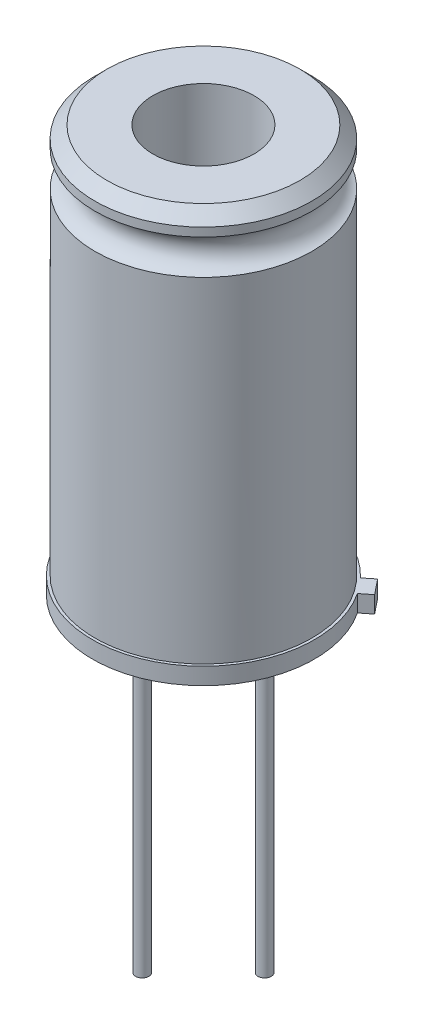
ISO-10303-21;
HEADER;
FILE_DESCRIPTION(('STEP AP214'),'2;1');
FILE_NAME('part.step','',(''),(''),'','','');
FILE_SCHEMA(('AUTOMOTIVE_DESIGN { 1 0 10303 214 1 1 1 1 }'));
ENDSEC;
DATA;
#1=APPLICATION_CONTEXT('core data for automotive mechanical design processes');
#2=APPLICATION_PROTOCOL_DEFINITION('international standard','automotive_design',2000,#1);
#3=PRODUCT_CONTEXT('',#1,'mechanical');
#4=PRODUCT('Part','Part','',(#3));
#5=PRODUCT_RELATED_PRODUCT_CATEGORY('part','',(#4));
#6=PRODUCT_DEFINITION_FORMATION('','',#4);
#7=PRODUCT_DEFINITION_CONTEXT('part definition',#1,'design');
#8=PRODUCT_DEFINITION('design','',#6,#7);
#9=PRODUCT_DEFINITION_SHAPE('','',#8);
#10=(LENGTH_UNIT() NAMED_UNIT(*) SI_UNIT(.MILLI.,.METRE.));
#11=(NAMED_UNIT(*) PLANE_ANGLE_UNIT() SI_UNIT($,.RADIAN.));
#12=(NAMED_UNIT(*) SI_UNIT($,.STERADIAN.) SOLID_ANGLE_UNIT());
#13=UNCERTAINTY_MEASURE_WITH_UNIT(LENGTH_MEASURE(1.E-05),#10,'distance_accuracy_value','');
#14=(GEOMETRIC_REPRESENTATION_CONTEXT(3) GLOBAL_UNCERTAINTY_ASSIGNED_CONTEXT((#13)) GLOBAL_UNIT_ASSIGNED_CONTEXT((#10,
#11,#12)) REPRESENTATION_CONTEXT('',''));
#15=CARTESIAN_POINT('',(0.,0.,0.));
#16=DIRECTION('',(0.,0.,1.));
#17=DIRECTION('',(1.,0.,0.));
#18=AXIS2_PLACEMENT_3D('',#15,#16,#17);
#19=CARTESIAN_POINT('',(0.,16.2,0.));
#20=DIRECTION('',(0.,-1.,0.));
#21=DIRECTION('',(0.,0.,-1.));
#22=AXIS2_PLACEMENT_3D('',#19,#20,#21);
#23=CYLINDRICAL_SURFACE('',#22,4.5);
#24=CARTESIAN_POINT('',(0.,15.7037584695949,0.));
#25=DIRECTION('',(0.,-1.,0.));
#26=DIRECTION('',(0.,0.,-1.));
#27=AXIS2_PLACEMENT_3D('',#24,#25,#26);
#28=CIRCLE('',#27,4.5);
#29=CARTESIAN_POINT('',(0.,15.7037584695949,-4.5));
#30=VERTEX_POINT('',#29);
#31=EDGE_CURVE('E252',#30,#30,#28,.T.);
#32=ORIENTED_EDGE('',*,*,#31,.T.);
#33=EDGE_LOOP('',(#32));
#34=FACE_BOUND('',#33,.T.);
#35=CARTESIAN_POINT('',(0.,15.34284161474,0.));
#36=DIRECTION('',(0.,-1.,0.));
#37=DIRECTION('',(0.,0.,-1.));
#38=AXIS2_PLACEMENT_3D('',#35,#36,#37);
#39=CIRCLE('',#38,4.5);
#40=CARTESIAN_POINT('',(0.,15.34284161474,-4.5));
#41=VERTEX_POINT('',#40);
#42=EDGE_CURVE('E125',#41,#41,#39,.T.);
#43=ORIENTED_EDGE('',*,*,#42,.F.);
#44=EDGE_LOOP('',(#43));
#45=FACE_BOUND('',#44,.T.);
#46=ADVANCED_FACE('F36',(#34,#45),#23,.T.);
#47=CARTESIAN_POINT('',(0.,14.62,0.));
#48=DIRECTION('',(0.,1.,0.));
#49=DIRECTION('',(0.,0.,1.));
#50=AXIS2_PLACEMENT_3D('',#47,#48,#49);
#51=TOROIDAL_SURFACE('',#50,4.7,0.749999999999999);
#52=CARTESIAN_POINT('',(0.,13.89715838526,0.));
#53=DIRECTION('',(0.,1.,0.));
#54=DIRECTION('',(0.,0.,1.));
#55=AXIS2_PLACEMENT_3D('',#52,#53,#54);
#56=CIRCLE('',#55,4.5);
#57=CARTESIAN_POINT('',(0.,13.89715838526,4.5));
#58=VERTEX_POINT('',#57);
#59=EDGE_CURVE('E117',#58,#58,#56,.T.);
#60=ORIENTED_EDGE('',*,*,#59,.T.);
#61=EDGE_LOOP('',(#60));
#62=FACE_BOUND('',#61,.T.);
#63=ORIENTED_EDGE('',*,*,#42,.T.);
#64=EDGE_LOOP('',(#63));
#65=FACE_BOUND('',#64,.T.);
#66=ADVANCED_FACE('F191',(#62,#65),#51,.F.);
#67=CARTESIAN_POINT('',(0.,0.,0.));
#68=DIRECTION('',(0.,-1.,0.));
#69=DIRECTION('',(0.,0.,-1.));
#70=AXIS2_PLACEMENT_3D('',#67,#68,#69);
#71=CIRCLE('',#70,4.5);
#72=CARTESIAN_POINT('',(0.,0.,-4.5));
#73=VERTEX_POINT('',#72);
#74=EDGE_CURVE('E114',#73,#73,#71,.T.);
#75=ORIENTED_EDGE('',*,*,#74,.F.);
#76=EDGE_LOOP('',(#75));
#77=FACE_BOUND('',#76,.T.);
#78=ORIENTED_EDGE('',*,*,#59,.F.);
#79=EDGE_LOOP('',(#78));
#80=FACE_BOUND('',#79,.T.);
#81=ADVANCED_FACE('F193',(#77,#80),#23,.T.);
#82=CARTESIAN_POINT('',(0.,-0.7,0.));
#83=DIRECTION('',(0.,1.,0.));
#84=DIRECTION('',(0.,0.,1.));
#85=AXIS2_PLACEMENT_3D('',#82,#83,#84);
#86=CYLINDRICAL_SURFACE('',#85,4.60963100218197);
#87=CARTESIAN_POINT('',(0.,0.,0.));
#88=DIRECTION('',(0.,-1.,0.));
#89=DIRECTION('',(0.,0.,-1.));
#90=AXIS2_PLACEMENT_3D('',#87,#88,#89);
#91=CIRCLE('',#90,4.60963100218197);
#92=CARTESIAN_POINT('',(3.8406891704971,0.,-2.54907918117571));
#93=VERTEX_POINT('',#92);
#94=CARTESIAN_POINT('',(3.34212620645192,0.,-3.17472682233045));
#95=VERTEX_POINT('',#94);
#96=EDGE_CURVE('E104',#93,#95,#91,.T.);
#97=ORIENTED_EDGE('',*,*,#96,.T.);
#98=DIRECTION('',(0.,1.,0.));
#99=VECTOR('',#98,1.);
#100=CARTESIAN_POINT('',(3.34212620645192,-0.7,-3.17472682233045));
#101=LINE('',#100,#99);
#102=CARTESIAN_POINT('',(3.34212620645192,-0.7,-3.17472682233045));
#103=VERTEX_POINT('',#102);
#104=EDGE_CURVE('E95',#103,#95,#101,.T.);
#105=ORIENTED_EDGE('',*,*,#104,.F.);
#106=CARTESIAN_POINT('',(0.,-0.7,0.));
#107=DIRECTION('',(0.,-1.,0.));
#108=DIRECTION('',(0.,0.,-1.));
#109=AXIS2_PLACEMENT_3D('',#106,#107,#108);
#110=CIRCLE('',#109,4.60963100218197);
#111=CARTESIAN_POINT('',(3.8406891704971,-0.7,-2.54907918117571));
#112=VERTEX_POINT('',#111);
#113=EDGE_CURVE('E89',#112,#103,#110,.T.);
#114=ORIENTED_EDGE('',*,*,#113,.F.);
#115=DIRECTION('',(0.,1.,0.));
#116=VECTOR('',#115,1.);
#117=CARTESIAN_POINT('',(3.8406891704971,-0.7,-2.54907918117571));
#118=LINE('',#117,#116);
#119=EDGE_CURVE('E100',#112,#93,#118,.T.);
#120=ORIENTED_EDGE('',*,*,#119,.T.);
#121=EDGE_LOOP('',(#97,#105,#114,#120));
#122=FACE_BOUND('',#121,.T.);
#123=ADVANCED_FACE('F202',(#122),#86,.T.);
#124=CARTESIAN_POINT('',(3.34212620645192,-0.7,-3.17472682233045));
#125=DIRECTION('',(0.623203705056468,0.,0.782059551443425));
#126=DIRECTION('',(0.782059551443425,0.,-0.623203705056468));
#127=AXIS2_PLACEMENT_3D('',#124,#125,#126);
#128=PLANE('',#127);
#129=DIRECTION('',(0.782059551443425,0.,-0.623203705056468));
#130=VECTOR('',#129,1.);
#131=CARTESIAN_POINT('',(3.34212620645192,0.,-3.17472682233045));
#132=LINE('',#131,#130);
#133=CARTESIAN_POINT('',(3.73922223033888,0.,-3.49116271636536));
#134=VERTEX_POINT('',#133);
#135=EDGE_CURVE('E94',#95,#134,#132,.T.);
#136=ORIENTED_EDGE('',*,*,#135,.T.);
#137=DIRECTION('',(0.,1.,0.));
#138=VECTOR('',#137,1.);
#139=CARTESIAN_POINT('',(3.73922223033888,-0.7,-3.49116271636536));
#140=LINE('',#139,#138);
#141=CARTESIAN_POINT('',(3.73922223033888,-0.7,-3.49116271636536));
#142=VERTEX_POINT('',#141);
#143=EDGE_CURVE('E92',#142,#134,#140,.T.);
#144=ORIENTED_EDGE('',*,*,#143,.F.);
#145=DIRECTION('',(0.782059551443425,0.,-0.623203705056468));
#146=VECTOR('',#145,1.);
#147=CARTESIAN_POINT('',(3.34212620645192,-0.7,-3.17472682233045));
#148=LINE('',#147,#146);
#149=EDGE_CURVE('E84',#103,#142,#148,.T.);
#150=ORIENTED_EDGE('',*,*,#149,.F.);
#151=ORIENTED_EDGE('',*,*,#104,.T.);
#152=EDGE_LOOP('',(#136,#144,#150,#151));
#153=FACE_BOUND('',#152,.T.);
#154=ADVANCED_FACE('F93',(#153),#128,.F.);
#155=CARTESIAN_POINT('',(3.73922223033888,-0.7,-3.49116271636536));
#156=DIRECTION('',(-0.782059551443424,0.,0.623203705056469));
#157=DIRECTION('',(0.623203705056469,0.,0.782059551443424));
#158=AXIS2_PLACEMENT_3D('',#155,#156,#157);
#159=PLANE('',#158);
#160=DIRECTION('',(0.623203705056468,0.,0.782059551443424));
#161=VECTOR('',#160,1.);
#162=CARTESIAN_POINT('',(3.73922223033888,0.,-3.49116271636536));
#163=LINE('',#162,#161);
#164=CARTESIAN_POINT('',(4.23778519438405,0.,-2.86551507521062));
#165=VERTEX_POINT('',#164);
#166=EDGE_CURVE('E70',#134,#165,#163,.T.);
#167=ORIENTED_EDGE('',*,*,#166,.T.);
#168=DIRECTION('',(0.,1.,0.));
#169=VECTOR('',#168,1.);
#170=CARTESIAN_POINT('',(4.23778519438405,-0.7,-2.86551507521062));
#171=LINE('',#170,#169);
#172=CARTESIAN_POINT('',(4.23778519438405,-0.7,-2.86551507521062));
#173=VERTEX_POINT('',#172);
#174=EDGE_CURVE('E96',#173,#165,#171,.T.);
#175=ORIENTED_EDGE('',*,*,#174,.F.);
#176=DIRECTION('',(0.623203705056468,0.,0.782059551443424));
#177=VECTOR('',#176,1.);
#178=CARTESIAN_POINT('',(3.73922223033888,-0.7,-3.49116271636536));
#179=LINE('',#178,#177);
#180=EDGE_CURVE('E87',#142,#173,#179,.T.);
#181=ORIENTED_EDGE('',*,*,#180,.F.);
#182=ORIENTED_EDGE('',*,*,#143,.T.);
#183=EDGE_LOOP('',(#167,#175,#181,#182));
#184=FACE_BOUND('',#183,.T.);
#185=ADVANCED_FACE('F98',(#184),#159,.F.);
#186=CARTESIAN_POINT('',(3.8406891704971,-0.7,-2.54907918117571));
#187=DIRECTION('',(-0.62320370505647,0.,-0.782059551443423));
#188=DIRECTION('',(-0.782059551443423,0.,0.62320370505647));
#189=AXIS2_PLACEMENT_3D('',#186,#187,#188);
#190=PLANE('',#189);
#191=DIRECTION('',(-0.782059551443423,0.,0.62320370505647));
#192=VECTOR('',#191,1.);
#193=CARTESIAN_POINT('',(3.8406891704971,0.,-2.54907918117571));
#194=LINE('',#193,#192);
#195=EDGE_CURVE('E76',#165,#93,#194,.T.);
#196=ORIENTED_EDGE('',*,*,#195,.T.);
#197=ORIENTED_EDGE('',*,*,#119,.F.);
#198=DIRECTION('',(-0.782059551443423,0.,0.62320370505647));
#199=VECTOR('',#198,1.);
#200=CARTESIAN_POINT('',(3.8406891704971,-0.7,-2.54907918117571));
#201=LINE('',#200,#199);
#202=EDGE_CURVE('E53',#173,#112,#201,.T.);
#203=ORIENTED_EDGE('',*,*,#202,.F.);
#204=ORIENTED_EDGE('',*,*,#174,.T.);
#205=EDGE_LOOP('',(#196,#197,#203,#204));
#206=FACE_BOUND('',#205,.T.);
#207=ADVANCED_FACE('F219',(#206),#190,.F.);
#208=CARTESIAN_POINT('',(0.,-0.7,0.));
#209=DIRECTION('',(0.,-1.,0.));
#210=DIRECTION('',(0.,0.,-1.));
#211=AXIS2_PLACEMENT_3D('',#208,#209,#210);
#212=PLANE('',#211);
#213=CARTESIAN_POINT('',(0.,-0.7,-2.54));
#214=DIRECTION('',(0.,1.,0.));
#215=DIRECTION('',(0.,0.,1.));
#216=AXIS2_PLACEMENT_3D('',#213,#214,#215);
#217=CIRCLE('',#216,0.8);
#218=CARTESIAN_POINT('',(0.,-0.7,-1.74));
#219=VERTEX_POINT('',#218);
#220=EDGE_CURVE('E151',#219,#219,#217,.T.);
#221=ORIENTED_EDGE('',*,*,#220,.T.);
#222=EDGE_LOOP('',(#221));
#223=FACE_BOUND('',#222,.T.);
#224=CARTESIAN_POINT('',(-2.54,-0.7,0.));
#225=DIRECTION('',(0.,1.,0.));
#226=DIRECTION('',(0.,0.,1.));
#227=AXIS2_PLACEMENT_3D('',#224,#225,#226);
#228=CIRCLE('',#227,0.8);
#229=CARTESIAN_POINT('',(-2.54,-0.7,0.799999999999982));
#230=VERTEX_POINT('',#229);
#231=EDGE_CURVE('E150',#230,#230,#228,.T.);
#232=ORIENTED_EDGE('',*,*,#231,.T.);
#233=EDGE_LOOP('',(#232));
#234=FACE_BOUND('',#233,.T.);
#235=CARTESIAN_POINT('',(0.,-0.7,2.54));
#236=DIRECTION('',(0.,1.,0.));
#237=DIRECTION('',(0.,0.,1.));
#238=AXIS2_PLACEMENT_3D('',#235,#236,#237);
#239=CIRCLE('',#238,0.8);
#240=CARTESIAN_POINT('',(0.,-0.7,3.34));
#241=VERTEX_POINT('',#240);
#242=EDGE_CURVE('E161',#241,#241,#239,.T.);
#243=ORIENTED_EDGE('',*,*,#242,.T.);
#244=EDGE_LOOP('',(#243));
#245=FACE_BOUND('',#244,.T.);
#246=CARTESIAN_POINT('',(2.54,-0.7,0.));
#247=DIRECTION('',(0.,1.,0.));
#248=DIRECTION('',(0.,0.,1.));
#249=AXIS2_PLACEMENT_3D('',#246,#247,#248);
#250=CIRCLE('',#249,0.8);
#251=CARTESIAN_POINT('',(2.54,-0.7,0.8));
#252=VERTEX_POINT('',#251);
#253=EDGE_CURVE('E107',#252,#252,#250,.T.);
#254=ORIENTED_EDGE('',*,*,#253,.T.);
#255=EDGE_LOOP('',(#254));
#256=FACE_BOUND('',#255,.T.);
#257=ORIENTED_EDGE('',*,*,#113,.T.);
#258=ORIENTED_EDGE('',*,*,#149,.T.);
#259=ORIENTED_EDGE('',*,*,#180,.T.);
#260=ORIENTED_EDGE('',*,*,#202,.T.);
#261=EDGE_LOOP('',(#257,#258,#259,#260));
#262=FACE_BOUND('',#261,.T.);
#263=ADVANCED_FACE('F85',(#223,#234,#245,#256,#262),#212,.T.);
#264=CARTESIAN_POINT('',(0.,0.,0.));
#265=DIRECTION('',(0.,-1.,0.));
#266=DIRECTION('',(0.,0.,-1.));
#267=AXIS2_PLACEMENT_3D('',#264,#265,#266);
#268=PLANE('',#267);
#269=ORIENTED_EDGE('',*,*,#74,.T.);
#270=EDGE_LOOP('',(#269));
#271=FACE_BOUND('',#270,.T.);
#272=ORIENTED_EDGE('',*,*,#96,.F.);
#273=ORIENTED_EDGE('',*,*,#195,.F.);
#274=ORIENTED_EDGE('',*,*,#166,.F.);
#275=ORIENTED_EDGE('',*,*,#135,.F.);
#276=EDGE_LOOP('',(#272,#273,#274,#275));
#277=FACE_BOUND('',#276,.T.);
#278=ADVANCED_FACE('F186',(#271,#277),#268,.F.);
#279=CARTESIAN_POINT('',(2.54,-0.7,0.));
#280=DIRECTION('',(0.,1.,0.));
#281=DIRECTION('',(0.,0.,1.));
#282=AXIS2_PLACEMENT_3D('',#279,#280,#281);
#283=CYLINDRICAL_SURFACE('',#282,0.8);
#284=ORIENTED_EDGE('',*,*,#253,.F.);
#285=EDGE_LOOP('',(#284));
#286=FACE_BOUND('',#285,.T.);
#287=CARTESIAN_POINT('',(2.54,0.,0.));
#288=DIRECTION('',(0.,1.,0.));
#289=DIRECTION('',(0.,0.,1.));
#290=AXIS2_PLACEMENT_3D('',#287,#288,#289);
#291=CIRCLE('',#290,0.8);
#292=CARTESIAN_POINT('',(2.54,0.,0.8));
#293=VERTEX_POINT('',#292);
#294=EDGE_CURVE('E164',#293,#293,#291,.T.);
#295=ORIENTED_EDGE('',*,*,#294,.T.);
#296=EDGE_LOOP('',(#295));
#297=FACE_BOUND('',#296,.T.);
#298=ADVANCED_FACE('F172',(#286,#297),#283,.F.);
#299=CARTESIAN_POINT('',(2.54,0.,0.));
#300=DIRECTION('',(0.,1.,0.));
#301=DIRECTION('',(0.,0.,1.));
#302=AXIS2_PLACEMENT_3D('',#299,#300,#301);
#303=PLANE('',#302);
#304=CARTESIAN_POINT('',(2.54,0.,0.));
#305=DIRECTION('',(0.,1.,0.));
#306=DIRECTION('',(0.,0.,1.));
#307=AXIS2_PLACEMENT_3D('',#304,#305,#306);
#308=CIRCLE('',#307,0.275);
#309=CARTESIAN_POINT('',(2.54,0.,0.275));
#310=VERTEX_POINT('',#309);
#311=EDGE_CURVE('E121',#310,#310,#308,.F.);
#312=ORIENTED_EDGE('',*,*,#311,.F.);
#313=EDGE_LOOP('',(#312));
#314=FACE_BOUND('',#313,.T.);
#315=ORIENTED_EDGE('',*,*,#294,.F.);
#316=EDGE_LOOP('',(#315));
#317=FACE_BOUND('',#316,.T.);
#318=ADVANCED_FACE('F174',(#314,#317),#303,.F.);
#319=CARTESIAN_POINT('',(0.,-0.7,2.54));
#320=DIRECTION('',(0.,1.,0.));
#321=DIRECTION('',(0.,0.,1.));
#322=AXIS2_PLACEMENT_3D('',#319,#320,#321);
#323=CYLINDRICAL_SURFACE('',#322,0.8);
#324=ORIENTED_EDGE('',*,*,#242,.F.);
#325=EDGE_LOOP('',(#324));
#326=FACE_BOUND('',#325,.T.);
#327=CARTESIAN_POINT('',(0.,0.,2.54));
#328=DIRECTION('',(0.,1.,0.));
#329=DIRECTION('',(0.,0.,1.));
#330=AXIS2_PLACEMENT_3D('',#327,#328,#329);
#331=CIRCLE('',#330,0.8);
#332=CARTESIAN_POINT('',(0.,0.,3.34));
#333=VERTEX_POINT('',#332);
#334=EDGE_CURVE('E154',#333,#333,#331,.T.);
#335=ORIENTED_EDGE('',*,*,#334,.T.);
#336=EDGE_LOOP('',(#335));
#337=FACE_BOUND('',#336,.T.);
#338=ADVANCED_FACE('F176',(#326,#337),#323,.F.);
#339=CARTESIAN_POINT('',(0.,0.,2.54));
#340=DIRECTION('',(0.,1.,0.));
#341=DIRECTION('',(0.,0.,1.));
#342=AXIS2_PLACEMENT_3D('',#339,#340,#341);
#343=PLANE('',#342);
#344=CARTESIAN_POINT('',(0.,0.,2.54));
#345=DIRECTION('',(0.,1.,0.));
#346=DIRECTION('',(0.,0.,1.));
#347=AXIS2_PLACEMENT_3D('',#344,#345,#346);
#348=CIRCLE('',#347,0.275);
#349=CARTESIAN_POINT('',(0.,0.,2.815));
#350=VERTEX_POINT('',#349);
#351=EDGE_CURVE('E11',#350,#350,#348,.F.);
#352=ORIENTED_EDGE('',*,*,#351,.F.);
#353=EDGE_LOOP('',(#352));
#354=FACE_BOUND('',#353,.T.);
#355=ORIENTED_EDGE('',*,*,#334,.F.);
#356=EDGE_LOOP('',(#355));
#357=FACE_BOUND('',#356,.T.);
#358=ADVANCED_FACE('F183',(#354,#357),#343,.F.);
#359=CARTESIAN_POINT('',(-2.54,-0.7,0.));
#360=DIRECTION('',(0.,1.,0.));
#361=DIRECTION('',(0.,0.,1.));
#362=AXIS2_PLACEMENT_3D('',#359,#360,#361);
#363=CYLINDRICAL_SURFACE('',#362,0.8);
#364=ORIENTED_EDGE('',*,*,#231,.F.);
#365=EDGE_LOOP('',(#364));
#366=FACE_BOUND('',#365,.T.);
#367=CARTESIAN_POINT('',(-2.54,0.,0.));
#368=DIRECTION('',(0.,1.,0.));
#369=DIRECTION('',(0.,0.,1.));
#370=AXIS2_PLACEMENT_3D('',#367,#368,#369);
#371=CIRCLE('',#370,0.8);
#372=CARTESIAN_POINT('',(-2.54,0.,0.799999999999982));
#373=VERTEX_POINT('',#372);
#374=EDGE_CURVE('E148',#373,#373,#371,.T.);
#375=ORIENTED_EDGE('',*,*,#374,.T.);
#376=EDGE_LOOP('',(#375));
#377=FACE_BOUND('',#376,.T.);
#378=ADVANCED_FACE('F144',(#366,#377),#363,.F.);
#379=CARTESIAN_POINT('',(-2.54,0.,0.));
#380=DIRECTION('',(0.,1.,0.));
#381=DIRECTION('',(0.,0.,1.));
#382=AXIS2_PLACEMENT_3D('',#379,#380,#381);
#383=PLANE('',#382);
#384=CARTESIAN_POINT('',(-2.54,0.,0.));
#385=DIRECTION('',(0.,1.,0.));
#386=DIRECTION('',(0.,0.,1.));
#387=AXIS2_PLACEMENT_3D('',#384,#385,#386);
#388=CIRCLE('',#387,0.275);
#389=CARTESIAN_POINT('',(-2.54,0.,0.275000000000018));
#390=VERTEX_POINT('',#389);
#391=EDGE_CURVE('E45',#390,#390,#388,.F.);
#392=ORIENTED_EDGE('',*,*,#391,.F.);
#393=EDGE_LOOP('',(#392));
#394=FACE_BOUND('',#393,.T.);
#395=ORIENTED_EDGE('',*,*,#374,.F.);
#396=EDGE_LOOP('',(#395));
#397=FACE_BOUND('',#396,.T.);
#398=ADVANCED_FACE('F140',(#394,#397),#383,.F.);
#399=CARTESIAN_POINT('',(0.,-0.7,-2.54));
#400=DIRECTION('',(0.,1.,0.));
#401=DIRECTION('',(0.,0.,1.));
#402=AXIS2_PLACEMENT_3D('',#399,#400,#401);
#403=CYLINDRICAL_SURFACE('',#402,0.8);
#404=ORIENTED_EDGE('',*,*,#220,.F.);
#405=EDGE_LOOP('',(#404));
#406=FACE_BOUND('',#405,.T.);
#407=CARTESIAN_POINT('',(0.,0.,-2.54));
#408=DIRECTION('',(0.,1.,0.));
#409=DIRECTION('',(0.,0.,1.));
#410=AXIS2_PLACEMENT_3D('',#407,#408,#409);
#411=CIRCLE('',#410,0.8);
#412=CARTESIAN_POINT('',(0.,0.,-1.74));
#413=VERTEX_POINT('',#412);
#414=EDGE_CURVE('E157',#413,#413,#411,.T.);
#415=ORIENTED_EDGE('',*,*,#414,.T.);
#416=EDGE_LOOP('',(#415));
#417=FACE_BOUND('',#416,.T.);
#418=ADVANCED_FACE('F143',(#406,#417),#403,.F.);
#419=CARTESIAN_POINT('',(0.,0.,-2.54));
#420=DIRECTION('',(0.,1.,0.));
#421=DIRECTION('',(0.,0.,1.));
#422=AXIS2_PLACEMENT_3D('',#419,#420,#421);
#423=PLANE('',#422);
#424=CARTESIAN_POINT('',(0.,0.,-2.54));
#425=DIRECTION('',(0.,1.,0.));
#426=DIRECTION('',(0.,0.,1.));
#427=AXIS2_PLACEMENT_3D('',#424,#425,#426);
#428=CIRCLE('',#427,0.275);
#429=CARTESIAN_POINT('',(0.,0.,-2.265));
#430=VERTEX_POINT('',#429);
#431=EDGE_CURVE('E132',#430,#430,#428,.F.);
#432=ORIENTED_EDGE('',*,*,#431,.F.);
#433=EDGE_LOOP('',(#432));
#434=FACE_BOUND('',#433,.T.);
#435=ORIENTED_EDGE('',*,*,#414,.F.);
#436=EDGE_LOOP('',(#435));
#437=FACE_BOUND('',#436,.T.);
#438=ADVANCED_FACE('F270',(#434,#437),#423,.F.);
#439=CARTESIAN_POINT('',(2.54,-13.,0.));
#440=DIRECTION('',(0.,1.,0.));
#441=DIRECTION('',(0.,0.,1.));
#442=AXIS2_PLACEMENT_3D('',#439,#440,#441);
#443=CYLINDRICAL_SURFACE('',#442,0.275);
#444=CARTESIAN_POINT('',(2.54,-13.,0.));
#445=DIRECTION('',(0.,-1.,0.));
#446=DIRECTION('',(0.,0.,-1.));
#447=AXIS2_PLACEMENT_3D('',#444,#445,#446);
#448=CIRCLE('',#447,0.275);
#449=CARTESIAN_POINT('',(2.54,-13.,-0.275));
#450=VERTEX_POINT('',#449);
#451=EDGE_CURVE('E264',#450,#450,#448,.T.);
#452=ORIENTED_EDGE('',*,*,#451,.F.);
#453=EDGE_LOOP('',(#452));
#454=FACE_BOUND('',#453,.T.);
#455=ORIENTED_EDGE('',*,*,#311,.T.);
#456=EDGE_LOOP('',(#455));
#457=FACE_BOUND('',#456,.T.);
#458=ADVANCED_FACE('F272',(#454,#457),#443,.T.);
#459=CARTESIAN_POINT('',(2.54,-13.,0.));
#460=DIRECTION('',(0.,-1.,0.));
#461=DIRECTION('',(0.,0.,-1.));
#462=AXIS2_PLACEMENT_3D('',#459,#460,#461);
#463=PLANE('',#462);
#464=ORIENTED_EDGE('',*,*,#451,.T.);
#465=EDGE_LOOP('',(#464));
#466=FACE_BOUND('',#465,.T.);
#467=ADVANCED_FACE('F279',(#466),#463,.T.);
#468=CARTESIAN_POINT('',(0.,-13.,-2.54));
#469=DIRECTION('',(0.,1.,0.));
#470=DIRECTION('',(0.,0.,1.));
#471=AXIS2_PLACEMENT_3D('',#468,#469,#470);
#472=CYLINDRICAL_SURFACE('',#471,0.275);
#473=CARTESIAN_POINT('',(0.,-13.,-2.54));
#474=DIRECTION('',(0.,-1.,0.));
#475=DIRECTION('',(0.,0.,-1.));
#476=AXIS2_PLACEMENT_3D('',#473,#474,#475);
#477=CIRCLE('',#476,0.275);
#478=CARTESIAN_POINT('',(0.,-13.,-2.815));
#479=VERTEX_POINT('',#478);
#480=EDGE_CURVE('E261',#479,#479,#477,.T.);
#481=ORIENTED_EDGE('',*,*,#480,.F.);
#482=EDGE_LOOP('',(#481));
#483=FACE_BOUND('',#482,.T.);
#484=ORIENTED_EDGE('',*,*,#431,.T.);
#485=EDGE_LOOP('',(#484));
#486=FACE_BOUND('',#485,.T.);
#487=ADVANCED_FACE('F322',(#483,#486),#472,.T.);
#488=CARTESIAN_POINT('',(0.,-13.,-2.54));
#489=DIRECTION('',(0.,-1.,0.));
#490=DIRECTION('',(0.,0.,-1.));
#491=AXIS2_PLACEMENT_3D('',#488,#489,#490);
#492=PLANE('',#491);
#493=ORIENTED_EDGE('',*,*,#480,.T.);
#494=EDGE_LOOP('',(#493));
#495=FACE_BOUND('',#494,.T.);
#496=ADVANCED_FACE('F318',(#495),#492,.T.);
#497=CARTESIAN_POINT('',(-2.54,-13.,0.));
#498=DIRECTION('',(0.,1.,0.));
#499=DIRECTION('',(0.,0.,1.));
#500=AXIS2_PLACEMENT_3D('',#497,#498,#499);
#501=CYLINDRICAL_SURFACE('',#500,0.275);
#502=CARTESIAN_POINT('',(-2.54,-13.,0.));
#503=DIRECTION('',(0.,-1.,0.));
#504=DIRECTION('',(0.,0.,-1.));
#505=AXIS2_PLACEMENT_3D('',#502,#503,#504);
#506=CIRCLE('',#505,0.275);
#507=CARTESIAN_POINT('',(-2.54,-13.,-0.274999999999982));
#508=VERTEX_POINT('',#507);
#509=EDGE_CURVE('E254',#508,#508,#506,.T.);
#510=ORIENTED_EDGE('',*,*,#509,.F.);
#511=EDGE_LOOP('',(#510));
#512=FACE_BOUND('',#511,.T.);
#513=ORIENTED_EDGE('',*,*,#391,.T.);
#514=EDGE_LOOP('',(#513));
#515=FACE_BOUND('',#514,.T.);
#516=ADVANCED_FACE('F138',(#512,#515),#501,.T.);
#517=CARTESIAN_POINT('',(-2.54,-13.,0.));
#518=DIRECTION('',(0.,-1.,0.));
#519=DIRECTION('',(0.,0.,-1.));
#520=AXIS2_PLACEMENT_3D('',#517,#518,#519);
#521=PLANE('',#520);
#522=ORIENTED_EDGE('',*,*,#509,.T.);
#523=EDGE_LOOP('',(#522));
#524=FACE_BOUND('',#523,.T.);
#525=ADVANCED_FACE('F302',(#524),#521,.T.);
#526=CARTESIAN_POINT('',(0.,-13.,2.54));
#527=DIRECTION('',(0.,1.,0.));
#528=DIRECTION('',(0.,0.,1.));
#529=AXIS2_PLACEMENT_3D('',#526,#527,#528);
#530=CYLINDRICAL_SURFACE('',#529,0.275);
#531=CARTESIAN_POINT('',(0.,-13.,2.54));
#532=DIRECTION('',(0.,-1.,0.));
#533=DIRECTION('',(0.,0.,-1.));
#534=AXIS2_PLACEMENT_3D('',#531,#532,#533);
#535=CIRCLE('',#534,0.275);
#536=CARTESIAN_POINT('',(0.,-13.,2.265));
#537=VERTEX_POINT('',#536);
#538=EDGE_CURVE('E251',#537,#537,#535,.T.);
#539=ORIENTED_EDGE('',*,*,#538,.F.);
#540=EDGE_LOOP('',(#539));
#541=FACE_BOUND('',#540,.T.);
#542=ORIENTED_EDGE('',*,*,#351,.T.);
#543=EDGE_LOOP('',(#542));
#544=FACE_BOUND('',#543,.T.);
#545=ADVANCED_FACE('F299',(#541,#544),#530,.T.);
#546=CARTESIAN_POINT('',(0.,-13.,2.54));
#547=DIRECTION('',(0.,-1.,0.));
#548=DIRECTION('',(0.,0.,-1.));
#549=AXIS2_PLACEMENT_3D('',#546,#547,#548);
#550=PLANE('',#549);
#551=ORIENTED_EDGE('',*,*,#538,.T.);
#552=EDGE_LOOP('',(#551));
#553=FACE_BOUND('',#552,.T.);
#554=ADVANCED_FACE('F301',(#553),#550,.T.);
#555=CARTESIAN_POINT('',(0.,16.2047509779198,0.));
#556=DIRECTION('',(0.,-1.,0.));
#557=DIRECTION('',(0.,0.,-1.));
#558=AXIS2_PLACEMENT_3D('',#555,#556,#557);
#559=CONICAL_SURFACE('',#558,4.00000098507374,0.784405654420794);
#560=CARTESIAN_POINT('',(0.,16.2,0.));
#561=DIRECTION('',(0.,1.,0.));
#562=DIRECTION('',(0.,0.,1.));
#563=AXIS2_PLACEMENT_3D('',#560,#561,#562);
#564=CIRCLE('',#563,4.00474254156482);
#565=CARTESIAN_POINT('',(0.,16.2,4.00474254156482));
#566=VERTEX_POINT('',#565);
#567=EDGE_CURVE('E39',#566,#566,#564,.F.);
#568=ORIENTED_EDGE('',*,*,#567,.T.);
#569=EDGE_LOOP('',(#568));
#570=FACE_BOUND('',#569,.T.);
#571=ORIENTED_EDGE('',*,*,#31,.F.);
#572=EDGE_LOOP('',(#571));
#573=FACE_BOUND('',#572,.T.);
#574=ADVANCED_FACE('F236',(#570,#573),#559,.T.);
#575=CARTESIAN_POINT('',(0.,3.,0.));
#576=DIRECTION('',(0.,1.,0.));
#577=DIRECTION('',(0.,0.,1.));
#578=AXIS2_PLACEMENT_3D('',#575,#576,#577);
#579=PLANE('',#578);
#580=CARTESIAN_POINT('',(0.,3.,0.));
#581=DIRECTION('',(0.,1.,0.));
#582=DIRECTION('',(0.,0.,1.));
#583=AXIS2_PLACEMENT_3D('',#580,#581,#582);
#584=CIRCLE('',#583,2.1);
#585=CARTESIAN_POINT('',(0.,3.,2.1));
#586=VERTEX_POINT('',#585);
#587=EDGE_CURVE('E118',#586,#586,#584,.T.);
#588=ORIENTED_EDGE('',*,*,#587,.T.);
#589=EDGE_LOOP('',(#588));
#590=FACE_BOUND('',#589,.T.);
#591=ADVANCED_FACE('F232',(#590),#579,.T.);
#592=CARTESIAN_POINT('',(0.,3.,0.));
#593=DIRECTION('',(0.,1.,0.));
#594=DIRECTION('',(0.,0.,1.));
#595=AXIS2_PLACEMENT_3D('',#592,#593,#594);
#596=CYLINDRICAL_SURFACE('',#595,2.1);
#597=ORIENTED_EDGE('',*,*,#587,.F.);
#598=EDGE_LOOP('',(#597));
#599=FACE_BOUND('',#598,.T.);
#600=CARTESIAN_POINT('',(0.,16.2,0.));
#601=DIRECTION('',(0.,1.,0.));
#602=DIRECTION('',(0.,0.,1.));
#603=AXIS2_PLACEMENT_3D('',#600,#601,#602);
#604=CIRCLE('',#603,2.1);
#605=CARTESIAN_POINT('',(0.,16.2,2.1));
#606=VERTEX_POINT('',#605);
#607=EDGE_CURVE('E122',#606,#606,#604,.T.);
#608=ORIENTED_EDGE('',*,*,#607,.T.);
#609=EDGE_LOOP('',(#608));
#610=FACE_BOUND('',#609,.T.);
#611=ADVANCED_FACE('F235',(#599,#610),#596,.F.);
#612=CARTESIAN_POINT('',(0.,16.2,0.));
#613=DIRECTION('',(0.,1.,0.));
#614=DIRECTION('',(0.,0.,1.));
#615=AXIS2_PLACEMENT_3D('',#612,#613,#614);
#616=PLANE('',#615);
#617=ORIENTED_EDGE('',*,*,#567,.F.);
#618=EDGE_LOOP('',(#617));
#619=FACE_BOUND('',#618,.T.);
#620=ORIENTED_EDGE('',*,*,#607,.F.);
#621=EDGE_LOOP('',(#620));
#622=FACE_BOUND('',#621,.T.);
#623=ADVANCED_FACE('F239',(#619,#622),#616,.T.);
#624=CLOSED_SHELL('',(#46,#66,#81,#123,#154,#185,#207,#263,#278,#298,#318,#338,#358,#378,#398,
#418,#438,#458,#467,#487,#496,#516,#525,#545,#554,#574,#591,#611,#623));
#625=MANIFOLD_SOLID_BREP('B2',#624);
#626=ADVANCED_BREP_SHAPE_REPRESENTATION('',(#18,#625),#14);
#627=SHAPE_DEFINITION_REPRESENTATION(#9,#626);
ENDSEC;
END-ISO-10303-21;
